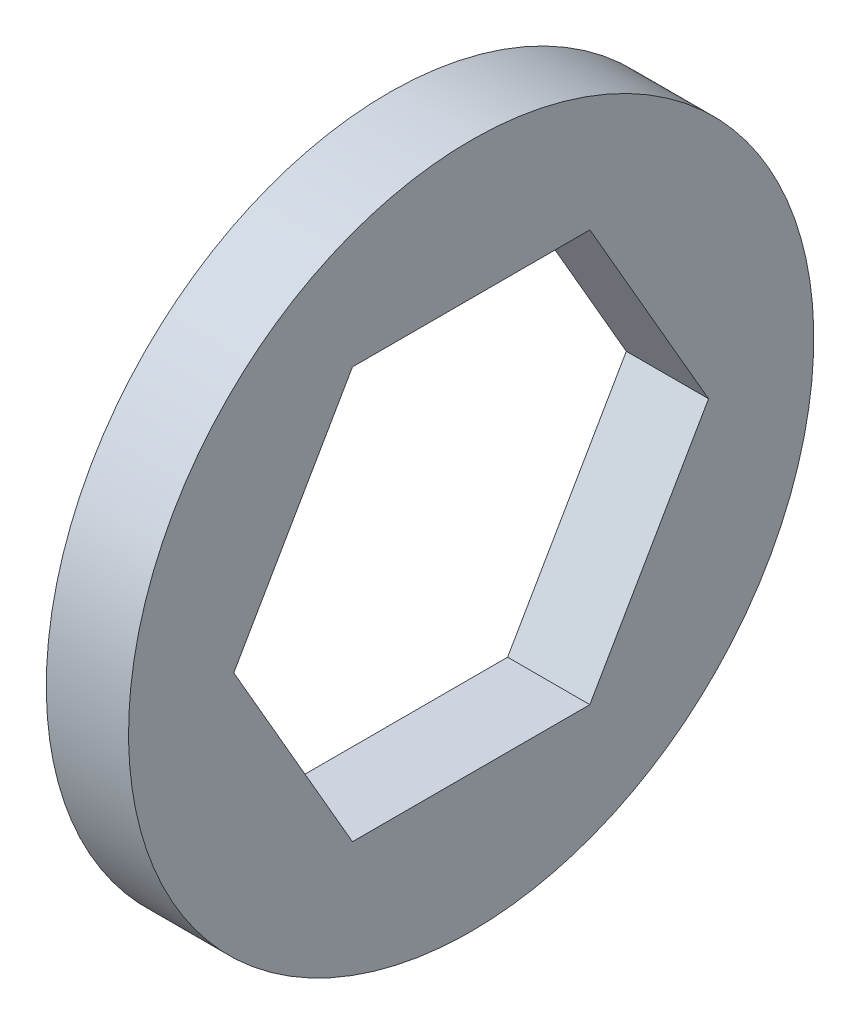
ISO-10303-21;
HEADER;
FILE_DESCRIPTION(('STEP AP214'),'2;1');
FILE_NAME('part.step','',(''),(''),'','','');
FILE_SCHEMA(('AUTOMOTIVE_DESIGN { 1 0 10303 214 1 1 1 1 }'));
ENDSEC;
DATA;
#1=APPLICATION_CONTEXT('core data for automotive mechanical design processes');
#2=APPLICATION_PROTOCOL_DEFINITION('international standard','automotive_design',2000,#1);
#3=PRODUCT_CONTEXT('',#1,'mechanical');
#4=PRODUCT('Part','Part','',(#3));
#5=PRODUCT_RELATED_PRODUCT_CATEGORY('part','',(#4));
#6=PRODUCT_DEFINITION_FORMATION('','',#4);
#7=PRODUCT_DEFINITION_CONTEXT('part definition',#1,'design');
#8=PRODUCT_DEFINITION('design','',#6,#7);
#9=PRODUCT_DEFINITION_SHAPE('','',#8);
#10=(LENGTH_UNIT() NAMED_UNIT(*) SI_UNIT(.MILLI.,.METRE.));
#11=(NAMED_UNIT(*) PLANE_ANGLE_UNIT() SI_UNIT($,.RADIAN.));
#12=(NAMED_UNIT(*) SI_UNIT($,.STERADIAN.) SOLID_ANGLE_UNIT());
#13=UNCERTAINTY_MEASURE_WITH_UNIT(LENGTH_MEASURE(1.E-05),#10,'distance_accuracy_value','');
#14=(GEOMETRIC_REPRESENTATION_CONTEXT(3) GLOBAL_UNCERTAINTY_ASSIGNED_CONTEXT((#13)) GLOBAL_UNIT_ASSIGNED_CONTEXT((#10,
#11,#12)) REPRESENTATION_CONTEXT('',''));
#15=CARTESIAN_POINT('',(0.,0.,0.));
#16=DIRECTION('',(0.,0.,1.));
#17=DIRECTION('',(1.,0.,0.));
#18=AXIS2_PLACEMENT_3D('',#15,#16,#17);
#19=CARTESIAN_POINT('',(-315.999999999998,100.,160.));
#20=CARTESIAN_POINT('',(-315.999999999998,100.,135.));
#21=CARTESIAN_POINT('',(-315.999999999998,125.,135.));
#22=CARTESIAN_POINT('',(-315.999999999998,150.,135.));
#23=CARTESIAN_POINT('',(-315.999999999998,150.,160.));
#24=CARTESIAN_POINT('',(-315.999999999998,150.,185.));
#25=CARTESIAN_POINT('',(-315.999999999998,125.,185.));
#26=CARTESIAN_POINT('',(-315.999999999998,100.,185.));
#27=CARTESIAN_POINT('',(-315.999999999998,100.,160.));
#28=CARTESIAN_POINT('',(-321.999999999998,100.,160.));
#29=CARTESIAN_POINT('',(-321.999999999998,100.,135.));
#30=CARTESIAN_POINT('',(-321.999999999998,125.,135.));
#31=CARTESIAN_POINT('',(-321.999999999998,150.,135.));
#32=CARTESIAN_POINT('',(-321.999999999998,150.,160.));
#33=CARTESIAN_POINT('',(-321.999999999998,150.,185.));
#34=CARTESIAN_POINT('',(-321.999999999998,125.,185.));
#35=CARTESIAN_POINT('',(-321.999999999998,100.,185.));
#36=CARTESIAN_POINT('',(-321.999999999998,100.,160.));
#37=(BOUNDED_SURFACE() B_SPLINE_SURFACE(1,2,((#19,#20,#21,#22,#23,#24,#25,#26,#27),(#28,#29,#30,
#31,#32,#33,#34,#35,#36)),.UNSPECIFIED.,.F.,.T.,.F.) B_SPLINE_SURFACE_WITH_KNOTS((2,2),(3,2,2,2,
3),(-0.0199999999999984,0.22),(-3.14159265358979,-1.5707963267949,0.,1.5707963267949,
3.14159265358979),.UNSPECIFIED.) GEOMETRIC_REPRESENTATION_ITEM() RATIONAL_B_SPLINE_SURFACE(((1.,
0.707106781186548,1.,0.707106781186548,1.,0.707106781186548,1.,0.707106781186548,1.),(1.,
0.707106781186548,1.,0.707106781186548,1.,0.707106781186548,1.,0.707106781186548,1.))) REPRESENTATION_ITEM('') SURFACE());
#38=CARTESIAN_POINT('',(-315.999999999998,100.,160.));
#39=CARTESIAN_POINT('',(-315.999999999998,100.,135.));
#40=CARTESIAN_POINT('',(-315.999999999998,125.,135.));
#41=CARTESIAN_POINT('',(-315.999999999998,150.,135.));
#42=CARTESIAN_POINT('',(-315.999999999998,150.,160.));
#43=CARTESIAN_POINT('',(-315.999999999998,150.,185.));
#44=CARTESIAN_POINT('',(-315.999999999998,125.,185.));
#45=CARTESIAN_POINT('',(-315.999999999998,100.,185.));
#46=CARTESIAN_POINT('',(-315.999999999998,100.,160.));
#47=(BOUNDED_CURVE() B_SPLINE_CURVE(2,(#38,#39,#40,#41,#42,#43,#44,#45,#46),.UNSPECIFIED.,.T.,
.F.) B_SPLINE_CURVE_WITH_KNOTS((3,2,2,2,3),(-3.14159265358979,-1.5707963267949,0.,
1.5707963267949,3.14159265358979),
.UNSPECIFIED.) CURVE() GEOMETRIC_REPRESENTATION_ITEM() RATIONAL_B_SPLINE_CURVE((1.,
0.707106781186547,1.,0.707106781186548,1.,0.707106781186548,1.,0.707106781186547,1.)) REPRESENTATION_ITEM(''));
#48=CARTESIAN_POINT('',(-315.999999999998,100.,160.));
#49=VERTEX_POINT('',#48);
#50=EDGE_CURVE('E148',#49,#49,#47,.T.);
#51=CARTESIAN_POINT('',(-315.999999999998,100.,160.));
#52=CARTESIAN_POINT('',(-321.999999999998,100.,160.));
#53=(BOUNDED_CURVE() B_SPLINE_CURVE(1,(#51,#52),.UNSPECIFIED.,.F.,
.F.) B_SPLINE_CURVE_WITH_KNOTS((2,2),(-0.22,0.0199999999999984),
.UNSPECIFIED.) CURVE() GEOMETRIC_REPRESENTATION_ITEM() RATIONAL_B_SPLINE_CURVE((1.,1.)) REPRESENTATION_ITEM(''));
#54=CARTESIAN_POINT('',(-321.999999999998,100.,160.));
#55=VERTEX_POINT('',#54);
#56=EDGE_CURVE('E11',#49,#55,#53,.T.);
#57=CARTESIAN_POINT('',(-321.999999999998,100.,160.));
#58=CARTESIAN_POINT('',(-321.999999999998,100.,135.));
#59=CARTESIAN_POINT('',(-321.999999999998,125.,135.));
#60=CARTESIAN_POINT('',(-321.999999999998,150.,135.));
#61=CARTESIAN_POINT('',(-321.999999999998,150.,160.));
#62=CARTESIAN_POINT('',(-321.999999999998,150.,185.));
#63=CARTESIAN_POINT('',(-321.999999999998,125.,185.));
#64=CARTESIAN_POINT('',(-321.999999999998,100.,185.));
#65=CARTESIAN_POINT('',(-321.999999999998,100.,160.));
#66=(BOUNDED_CURVE() B_SPLINE_CURVE(2,(#57,#58,#59,#60,#61,#62,#63,#64,#65),.UNSPECIFIED.,.T.,
.F.) B_SPLINE_CURVE_WITH_KNOTS((3,2,2,2,3),(-3.14159265358979,-1.5707963267949,0.,
1.5707963267949,3.14159265358979),
.UNSPECIFIED.) CURVE() GEOMETRIC_REPRESENTATION_ITEM() RATIONAL_B_SPLINE_CURVE((1.,
0.707106781186547,1.,0.707106781186548,1.,0.707106781186547,1.,0.707106781186547,1.)) REPRESENTATION_ITEM(''));
#67=EDGE_CURVE('E53',#55,#55,#66,.T.);
#68=ORIENTED_EDGE('',*,*,#50,.F.);
#69=ORIENTED_EDGE('',*,*,#56,.T.);
#70=ORIENTED_EDGE('',*,*,#67,.T.);
#71=ORIENTED_EDGE('',*,*,#56,.F.);
#72=EDGE_LOOP('',(#68,#69,#70,#71));
#73=FACE_BOUND('',#72,.T.);
#74=ADVANCED_FACE('F40',(#73),#37,.T.);
#75=CARTESIAN_POINT('',(-315.999999999998,99.99,134.99));
#76=CARTESIAN_POINT('',(-315.999999999998,99.99,185.01));
#77=CARTESIAN_POINT('',(-315.999999999998,150.01,134.99));
#78=CARTESIAN_POINT('',(-315.999999999998,150.01,185.01));
#79=(BOUNDED_SURFACE() B_SPLINE_SURFACE(1,1,((#75,#76),(#77,#78)),.UNSPECIFIED.,.F.,.F.,
.F.) B_SPLINE_SURFACE_WITH_KNOTS((2,2),(2,2),(-6.251,-1.24899999999998),(-2.501,2.501),
.UNSPECIFIED.) GEOMETRIC_REPRESENTATION_ITEM() RATIONAL_B_SPLINE_SURFACE(((1.,1.),(1.,1.))) REPRESENTATION_ITEM('') SURFACE());
#80=DIRECTION('',(0.,0.866025403784439,-0.499999999999999));
#81=VECTOR('',#80,1.);
#82=CARTESIAN_POINT('',(-315.999999999998,109.999999999995,151.339745962156));
#83=LINE('',#82,#81);
#84=CARTESIAN_POINT('',(-315.999999999998,109.999999999995,151.339745962156));
#85=VERTEX_POINT('',#84);
#86=CARTESIAN_POINT('',(-315.999999999998,124.999999999995,142.679491924311));
#87=VERTEX_POINT('',#86);
#88=EDGE_CURVE('E60',#85,#87,#83,.T.);
#89=DIRECTION('',(0.,0.,-1.));
#90=VECTOR('',#89,1.);
#91=CARTESIAN_POINT('',(-315.999999999998,109.999999999995,168.660254037844));
#92=LINE('',#91,#90);
#93=CARTESIAN_POINT('',(-315.999999999998,109.999999999995,168.660254037844));
#94=VERTEX_POINT('',#93);
#95=EDGE_CURVE('E122',#94,#85,#92,.T.);
#96=DIRECTION('',(0.,-0.866025403784437,-0.500000000000003));
#97=VECTOR('',#96,1.);
#98=CARTESIAN_POINT('',(-315.999999999998,124.999999999995,177.320508075689));
#99=LINE('',#98,#97);
#100=CARTESIAN_POINT('',(-315.999999999998,124.999999999995,177.320508075689));
#101=VERTEX_POINT('',#100);
#102=EDGE_CURVE('E125',#101,#94,#99,.T.);
#103=DIRECTION('',(0.,-0.86602540378444,0.499999999999997));
#104=VECTOR('',#103,1.);
#105=CARTESIAN_POINT('',(-315.999999999998,139.999999999995,168.660254037844));
#106=LINE('',#105,#104);
#107=CARTESIAN_POINT('',(-315.999999999998,139.999999999995,168.660254037844));
#108=VERTEX_POINT('',#107);
#109=EDGE_CURVE('E141',#108,#101,#106,.T.);
#110=DIRECTION('',(0.,0.,1.));
#111=VECTOR('',#110,1.);
#112=CARTESIAN_POINT('',(-315.999999999998,139.999999999995,151.339745962156));
#113=LINE('',#112,#111);
#114=CARTESIAN_POINT('',(-315.999999999998,139.999999999995,151.339745962156));
#115=VERTEX_POINT('',#114);
#116=EDGE_CURVE('E138',#115,#108,#113,.T.);
#117=DIRECTION('',(0.,0.866025403784437,0.500000000000003));
#118=VECTOR('',#117,1.);
#119=CARTESIAN_POINT('',(-315.999999999998,124.999999999995,142.679491924311));
#120=LINE('',#119,#118);
#121=EDGE_CURVE('E136',#87,#115,#120,.T.);
#122=ORIENTED_EDGE('',*,*,#88,.F.);
#123=ORIENTED_EDGE('',*,*,#95,.F.);
#124=ORIENTED_EDGE('',*,*,#102,.F.);
#125=ORIENTED_EDGE('',*,*,#109,.F.);
#126=ORIENTED_EDGE('',*,*,#116,.F.);
#127=ORIENTED_EDGE('',*,*,#121,.F.);
#128=EDGE_LOOP('',(#122,#123,#124,#125,#126,#127));
#129=FACE_BOUND('',#128,.T.);
#130=ORIENTED_EDGE('',*,*,#50,.T.);
#131=EDGE_LOOP('',(#130));
#132=FACE_BOUND('',#131,.T.);
#133=ADVANCED_FACE('F174',(#129,#132),#79,.T.);
#134=CARTESIAN_POINT('',(-321.999999999998,150.01,134.99));
#135=CARTESIAN_POINT('',(-321.999999999998,150.01,185.01));
#136=CARTESIAN_POINT('',(-321.999999999998,99.99,134.99));
#137=CARTESIAN_POINT('',(-321.999999999998,99.99,185.01));
#138=(BOUNDED_SURFACE() B_SPLINE_SURFACE(1,1,((#134,#135),(#136,#137)),.UNSPECIFIED.,.F.,.F.,
.F.) B_SPLINE_SURFACE_WITH_KNOTS((2,2),(2,2),(-6.251,-1.24899999999998),(-2.501,2.501),
.UNSPECIFIED.) GEOMETRIC_REPRESENTATION_ITEM() RATIONAL_B_SPLINE_SURFACE(((1.,1.),(1.,1.))) REPRESENTATION_ITEM('') SURFACE());
#139=DIRECTION('',(0.,0.866025403784439,-0.499999999999999));
#140=VECTOR('',#139,1.);
#141=CARTESIAN_POINT('',(-321.999999999999,109.999999999995,151.339745962156));
#142=LINE('',#141,#140);
#143=CARTESIAN_POINT('',(-321.999999999999,109.999999999995,151.339745962156));
#144=VERTEX_POINT('',#143);
#145=CARTESIAN_POINT('',(-321.999999999999,124.999999999995,142.679491924311));
#146=VERTEX_POINT('',#145);
#147=EDGE_CURVE('E106',#144,#146,#142,.T.);
#148=DIRECTION('',(0.,0.866025403784437,0.500000000000003));
#149=VECTOR('',#148,1.);
#150=CARTESIAN_POINT('',(-321.999999999999,124.999999999995,142.679491924311));
#151=LINE('',#150,#149);
#152=CARTESIAN_POINT('',(-321.999999999998,139.999999999995,151.339745962156));
#153=VERTEX_POINT('',#152);
#154=EDGE_CURVE('E115',#146,#153,#151,.T.);
#155=DIRECTION('',(0.,0.,1.));
#156=VECTOR('',#155,1.);
#157=CARTESIAN_POINT('',(-321.999999999998,139.999999999995,151.339745962156));
#158=LINE('',#157,#156);
#159=CARTESIAN_POINT('',(-321.999999999998,139.999999999995,168.660254037844));
#160=VERTEX_POINT('',#159);
#161=EDGE_CURVE('E68',#153,#160,#158,.T.);
#162=DIRECTION('',(0.,-0.86602540378444,0.499999999999997));
#163=VECTOR('',#162,1.);
#164=CARTESIAN_POINT('',(-321.999999999998,139.999999999995,168.660254037844));
#165=LINE('',#164,#163);
#166=CARTESIAN_POINT('',(-321.999999999999,124.999999999995,177.320508075689));
#167=VERTEX_POINT('',#166);
#168=EDGE_CURVE('E129',#160,#167,#165,.T.);
#169=DIRECTION('',(0.,-0.866025403784437,-0.500000000000003));
#170=VECTOR('',#169,1.);
#171=CARTESIAN_POINT('',(-321.999999999999,124.999999999995,177.320508075689));
#172=LINE('',#171,#170);
#173=CARTESIAN_POINT('',(-321.999999999999,109.999999999995,168.660254037844));
#174=VERTEX_POINT('',#173);
#175=EDGE_CURVE('E132',#167,#174,#172,.T.);
#176=DIRECTION('',(0.,0.,-1.));
#177=VECTOR('',#176,1.);
#178=CARTESIAN_POINT('',(-321.999999999999,109.999999999995,168.660254037844));
#179=LINE('',#178,#177);
#180=EDGE_CURVE('E112',#174,#144,#179,.T.);
#181=ORIENTED_EDGE('',*,*,#147,.T.);
#182=ORIENTED_EDGE('',*,*,#154,.T.);
#183=ORIENTED_EDGE('',*,*,#161,.T.);
#184=ORIENTED_EDGE('',*,*,#168,.T.);
#185=ORIENTED_EDGE('',*,*,#175,.T.);
#186=ORIENTED_EDGE('',*,*,#180,.T.);
#187=EDGE_LOOP('',(#181,#182,#183,#184,#185,#186));
#188=FACE_BOUND('',#187,.T.);
#189=ORIENTED_EDGE('',*,*,#67,.F.);
#190=EDGE_LOOP('',(#189));
#191=FACE_BOUND('',#190,.T.);
#192=ADVANCED_FACE('F42',(#188,#191),#138,.T.);
#193=CARTESIAN_POINT('',(-321.999999999999,109.999999999995,151.339745962156));
#194=DIRECTION('',(0.,-0.499999999999999,-0.866025403784439));
#195=DIRECTION('',(0.,0.866025403784439,-0.499999999999999));
#196=AXIS2_PLACEMENT_3D('',#193,#194,#195);
#197=PLANE('',#196);
#198=ORIENTED_EDGE('',*,*,#88,.T.);
#199=DIRECTION('',(1.,0.,0.));
#200=VECTOR('',#199,1.);
#201=CARTESIAN_POINT('',(-321.999999999999,124.999999999995,142.679491924311));
#202=LINE('',#201,#200);
#203=EDGE_CURVE('E102',#146,#87,#202,.T.);
#204=ORIENTED_EDGE('',*,*,#203,.F.);
#205=ORIENTED_EDGE('',*,*,#147,.F.);
#206=DIRECTION('',(1.,0.,0.));
#207=VECTOR('',#206,1.);
#208=CARTESIAN_POINT('',(-321.999999999999,109.999999999995,151.339745962156));
#209=LINE('',#208,#207);
#210=EDGE_CURVE('E146',#144,#85,#209,.T.);
#211=ORIENTED_EDGE('',*,*,#210,.T.);
#212=EDGE_LOOP('',(#198,#204,#205,#211));
#213=FACE_BOUND('',#212,.T.);
#214=ADVANCED_FACE('F104',(#213),#197,.F.);
#215=CARTESIAN_POINT('',(-321.999999999999,109.999999999995,168.660254037844));
#216=DIRECTION('',(0.,-1.,0.));
#217=DIRECTION('',(1.,0.,0.));
#218=AXIS2_PLACEMENT_3D('',#215,#216,#217);
#219=PLANE('',#218);
#220=ORIENTED_EDGE('',*,*,#95,.T.);
#221=ORIENTED_EDGE('',*,*,#210,.F.);
#222=ORIENTED_EDGE('',*,*,#180,.F.);
#223=DIRECTION('',(1.,0.,0.));
#224=VECTOR('',#223,1.);
#225=CARTESIAN_POINT('',(-321.999999999999,109.999999999995,168.660254037844));
#226=LINE('',#225,#224);
#227=EDGE_CURVE('E149',#174,#94,#226,.T.);
#228=ORIENTED_EDGE('',*,*,#227,.T.);
#229=EDGE_LOOP('',(#220,#221,#222,#228));
#230=FACE_BOUND('',#229,.T.);
#231=ADVANCED_FACE('F181',(#230),#219,.F.);
#232=CARTESIAN_POINT('',(-321.999999999999,124.999999999995,177.320508075689));
#233=DIRECTION('',(0.,-0.500000000000003,0.866025403784437));
#234=DIRECTION('',(0.,-0.866025403784437,-0.500000000000003));
#235=AXIS2_PLACEMENT_3D('',#232,#233,#234);
#236=PLANE('',#235);
#237=ORIENTED_EDGE('',*,*,#102,.T.);
#238=ORIENTED_EDGE('',*,*,#227,.F.);
#239=ORIENTED_EDGE('',*,*,#175,.F.);
#240=DIRECTION('',(1.,0.,0.));
#241=VECTOR('',#240,1.);
#242=CARTESIAN_POINT('',(-321.999999999999,124.999999999995,177.320508075689));
#243=LINE('',#242,#241);
#244=EDGE_CURVE('E151',#167,#101,#243,.T.);
#245=ORIENTED_EDGE('',*,*,#244,.T.);
#246=EDGE_LOOP('',(#237,#238,#239,#245));
#247=FACE_BOUND('',#246,.T.);
#248=ADVANCED_FACE('F211',(#247),#236,.F.);
#249=CARTESIAN_POINT('',(-321.999999999998,139.999999999995,168.660254037844));
#250=DIRECTION('',(0.,0.499999999999997,0.86602540378444));
#251=DIRECTION('',(0.,-0.86602540378444,0.499999999999997));
#252=AXIS2_PLACEMENT_3D('',#249,#250,#251);
#253=PLANE('',#252);
#254=ORIENTED_EDGE('',*,*,#109,.T.);
#255=ORIENTED_EDGE('',*,*,#244,.F.);
#256=ORIENTED_EDGE('',*,*,#168,.F.);
#257=DIRECTION('',(1.,0.,0.));
#258=VECTOR('',#257,1.);
#259=CARTESIAN_POINT('',(-321.999999999998,139.999999999995,168.660254037844));
#260=LINE('',#259,#258);
#261=EDGE_CURVE('E153',#160,#108,#260,.T.);
#262=ORIENTED_EDGE('',*,*,#261,.T.);
#263=EDGE_LOOP('',(#254,#255,#256,#262));
#264=FACE_BOUND('',#263,.T.);
#265=ADVANCED_FACE('F208',(#264),#253,.F.);
#266=CARTESIAN_POINT('',(-321.999999999998,139.999999999995,151.339745962156));
#267=DIRECTION('',(0.,1.,0.));
#268=DIRECTION('',(-1.,0.,0.));
#269=AXIS2_PLACEMENT_3D('',#266,#267,#268);
#270=PLANE('',#269);
#271=ORIENTED_EDGE('',*,*,#116,.T.);
#272=ORIENTED_EDGE('',*,*,#261,.F.);
#273=ORIENTED_EDGE('',*,*,#161,.F.);
#274=DIRECTION('',(1.,0.,0.));
#275=VECTOR('',#274,1.);
#276=CARTESIAN_POINT('',(-321.999999999998,139.999999999995,151.339745962156));
#277=LINE('',#276,#275);
#278=EDGE_CURVE('E111',#153,#115,#277,.T.);
#279=ORIENTED_EDGE('',*,*,#278,.T.);
#280=EDGE_LOOP('',(#271,#272,#273,#279));
#281=FACE_BOUND('',#280,.T.);
#282=ADVANCED_FACE('F205',(#281),#270,.F.);
#283=CARTESIAN_POINT('',(-321.999999999999,124.999999999995,142.679491924311));
#284=DIRECTION('',(0.,0.500000000000003,-0.866025403784437));
#285=DIRECTION('',(0.,0.866025403784437,0.500000000000003));
#286=AXIS2_PLACEMENT_3D('',#283,#284,#285);
#287=PLANE('',#286);
#288=ORIENTED_EDGE('',*,*,#121,.T.);
#289=ORIENTED_EDGE('',*,*,#278,.F.);
#290=ORIENTED_EDGE('',*,*,#154,.F.);
#291=ORIENTED_EDGE('',*,*,#203,.T.);
#292=EDGE_LOOP('',(#288,#289,#290,#291));
#293=FACE_BOUND('',#292,.T.);
#294=ADVANCED_FACE('F116',(#293),#287,.F.);
#295=CLOSED_SHELL('',(#74,#133,#192,#214,#231,#248,#265,#282,#294));
#296=MANIFOLD_SOLID_BREP('B2',#295);
#297=ADVANCED_BREP_SHAPE_REPRESENTATION('',(#18,#296),#14);
#298=SHAPE_DEFINITION_REPRESENTATION(#9,#297);
ENDSEC;
END-ISO-10303-21;
